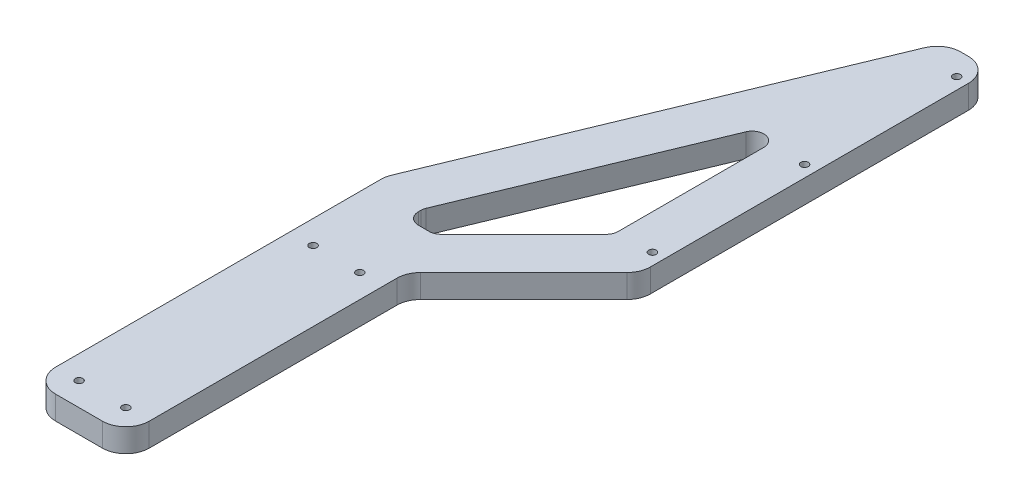
ISO-10303-21;
HEADER;
FILE_DESCRIPTION(('STEP AP214'),'2;1');
FILE_NAME('part.step','',(''),(''),'','','');
FILE_SCHEMA(('AUTOMOTIVE_DESIGN { 1 0 10303 214 1 1 1 1 }'));
ENDSEC;
DATA;
#1=APPLICATION_CONTEXT('core data for automotive mechanical design processes');
#2=APPLICATION_PROTOCOL_DEFINITION('international standard','automotive_design',2000,#1);
#3=PRODUCT_CONTEXT('',#1,'mechanical');
#4=PRODUCT('Part','Part','',(#3));
#5=PRODUCT_RELATED_PRODUCT_CATEGORY('part','',(#4));
#6=PRODUCT_DEFINITION_FORMATION('','',#4);
#7=PRODUCT_DEFINITION_CONTEXT('part definition',#1,'design');
#8=PRODUCT_DEFINITION('design','',#6,#7);
#9=PRODUCT_DEFINITION_SHAPE('','',#8);
#10=(LENGTH_UNIT() NAMED_UNIT(*) SI_UNIT(.MILLI.,.METRE.));
#11=(NAMED_UNIT(*) PLANE_ANGLE_UNIT() SI_UNIT($,.RADIAN.));
#12=(NAMED_UNIT(*) SI_UNIT($,.STERADIAN.) SOLID_ANGLE_UNIT());
#13=UNCERTAINTY_MEASURE_WITH_UNIT(LENGTH_MEASURE(1.E-05),#10,'distance_accuracy_value','');
#14=(GEOMETRIC_REPRESENTATION_CONTEXT(3) GLOBAL_UNCERTAINTY_ASSIGNED_CONTEXT((#13)) GLOBAL_UNIT_ASSIGNED_CONTEXT((#10,
#11,#12)) REPRESENTATION_CONTEXT('',''));
#15=CARTESIAN_POINT('',(0.,0.,0.));
#16=DIRECTION('',(0.,0.,1.));
#17=DIRECTION('',(1.,0.,0.));
#18=AXIS2_PLACEMENT_3D('',#15,#16,#17);
#19=CARTESIAN_POINT('',(0.,10.,0.));
#20=DIRECTION('',(0.,-1.,0.));
#21=DIRECTION('',(0.,0.,-1.));
#22=AXIS2_PLACEMENT_3D('',#19,#20,#21);
#23=PLANE('',#22);
#24=CARTESIAN_POINT('',(85.,10.,-310.000000000001));
#25=DIRECTION('',(0.,-1.,0.));
#26=DIRECTION('',(0.,0.,-1.));
#27=AXIS2_PLACEMENT_3D('',#24,#25,#26);
#28=CIRCLE('',#27,1.6);
#29=CARTESIAN_POINT('',(85.,10.,-311.600000000001));
#30=VERTEX_POINT('',#29);
#31=EDGE_CURVE('E521',#30,#30,#28,.T.);
#32=ORIENTED_EDGE('',*,*,#31,.T.);
#33=EDGE_LOOP('',(#32));
#34=FACE_BOUND('',#33,.T.);
#35=CARTESIAN_POINT('',(85.,10.,-245.000000000001));
#36=DIRECTION('',(0.,-1.,0.));
#37=DIRECTION('',(0.,0.,-1.));
#38=AXIS2_PLACEMENT_3D('',#35,#36,#37);
#39=CIRCLE('',#38,1.6);
#40=CARTESIAN_POINT('',(85.,10.,-246.600000000001));
#41=VERTEX_POINT('',#40);
#42=EDGE_CURVE('E525',#41,#41,#39,.T.);
#43=ORIENTED_EDGE('',*,*,#42,.T.);
#44=EDGE_LOOP('',(#43));
#45=FACE_BOUND('',#44,.T.);
#46=CARTESIAN_POINT('',(85.,10.,-180.000000000001));
#47=DIRECTION('',(0.,-1.,0.));
#48=DIRECTION('',(0.,0.,-1.));
#49=AXIS2_PLACEMENT_3D('',#46,#47,#48);
#50=CIRCLE('',#49,1.6);
#51=CARTESIAN_POINT('',(85.,10.,-181.600000000001));
#52=VERTEX_POINT('',#51);
#53=EDGE_CURVE('E529',#52,#52,#50,.T.);
#54=ORIENTED_EDGE('',*,*,#53,.T.);
#55=EDGE_LOOP('',(#54));
#56=FACE_BOUND('',#55,.T.);
#57=CARTESIAN_POINT('',(30.,10.,-110.));
#58=DIRECTION('',(0.,-1.,0.));
#59=DIRECTION('',(0.,0.,-1.));
#60=AXIS2_PLACEMENT_3D('',#57,#58,#59);
#61=CIRCLE('',#60,1.6);
#62=CARTESIAN_POINT('',(30.,10.,-111.6));
#63=VERTEX_POINT('',#62);
#64=EDGE_CURVE('E472',#63,#63,#61,.T.);
#65=ORIENTED_EDGE('',*,*,#64,.T.);
#66=EDGE_LOOP('',(#65));
#67=FACE_BOUND('',#66,.T.);
#68=CARTESIAN_POINT('',(10.,10.,-10.));
#69=DIRECTION('',(0.,-1.,0.));
#70=DIRECTION('',(0.,0.,-1.));
#71=AXIS2_PLACEMENT_3D('',#68,#69,#70);
#72=CIRCLE('',#71,1.6);
#73=CARTESIAN_POINT('',(10.,10.,-11.6));
#74=VERTEX_POINT('',#73);
#75=EDGE_CURVE('E493',#74,#74,#72,.T.);
#76=ORIENTED_EDGE('',*,*,#75,.T.);
#77=EDGE_LOOP('',(#76));
#78=FACE_BOUND('',#77,.T.);
#79=CARTESIAN_POINT('',(30.,10.,-10.));
#80=DIRECTION('',(0.,-1.,0.));
#81=DIRECTION('',(0.,0.,-1.));
#82=AXIS2_PLACEMENT_3D('',#79,#80,#81);
#83=CIRCLE('',#82,1.6);
#84=CARTESIAN_POINT('',(30.,10.,-11.6));
#85=VERTEX_POINT('',#84);
#86=EDGE_CURVE('E497',#85,#85,#83,.T.);
#87=ORIENTED_EDGE('',*,*,#86,.T.);
#88=EDGE_LOOP('',(#87));
#89=FACE_BOUND('',#88,.T.);
#90=CARTESIAN_POINT('',(10.,10.,-110.));
#91=DIRECTION('',(0.,-1.,0.));
#92=DIRECTION('',(0.,0.,-1.));
#93=AXIS2_PLACEMENT_3D('',#90,#91,#92);
#94=CIRCLE('',#93,1.6);
#95=CARTESIAN_POINT('',(10.,10.,-111.6));
#96=VERTEX_POINT('',#95);
#97=EDGE_CURVE('E501',#96,#96,#94,.T.);
#98=ORIENTED_EDGE('',*,*,#97,.T.);
#99=EDGE_LOOP('',(#98));
#100=FACE_BOUND('',#99,.T.);
#101=DIRECTION('',(-0.382683432365091,0.,0.923879532511286));
#102=VECTOR('',#101,1.);
#103=CARTESIAN_POINT('',(0.,10.,-151.005050633884));
#104=LINE('',#103,#102);
#105=CARTESIAN_POINT('',(67.4429910540801,10.,-313.826834323651));
#106=VERTEX_POINT('',#105);
#107=CARTESIAN_POINT('',(0.761204674887139,10.,-152.842761283739));
#108=VERTEX_POINT('',#107);
#109=EDGE_CURVE('E238',#106,#108,#104,.T.);
#110=ORIENTED_EDGE('',*,*,#109,.T.);
#111=CARTESIAN_POINT('',(10.,10.,-149.015926960088));
#112=DIRECTION('',(0.,-1.,0.));
#113=DIRECTION('',(0.,0.,-1.));
#114=AXIS2_PLACEMENT_3D('',#111,#112,#113);
#115=CIRCLE('',#114,10.);
#116=CARTESIAN_POINT('',(0.,10.,-149.015926960088));
#117=VERTEX_POINT('',#116);
#118=EDGE_CURVE('E348',#108,#117,#115,.F.);
#119=ORIENTED_EDGE('',*,*,#118,.T.);
#120=DIRECTION('',(0.,0.,1.));
#121=VECTOR('',#120,1.);
#122=CARTESIAN_POINT('',(0.,10.,0.));
#123=LINE('',#122,#121);
#124=CARTESIAN_POINT('',(0.,10.,-10.));
#125=VERTEX_POINT('',#124);
#126=EDGE_CURVE('E447',#117,#125,#123,.T.);
#127=ORIENTED_EDGE('',*,*,#126,.T.);
#128=CARTESIAN_POINT('',(10.,10.,-10.));
#129=DIRECTION('',(0.,-1.,0.));
#130=DIRECTION('',(0.,0.,-1.));
#131=AXIS2_PLACEMENT_3D('',#128,#129,#130);
#132=CIRCLE('',#131,10.);
#133=CARTESIAN_POINT('',(10.,10.,0.));
#134=VERTEX_POINT('',#133);
#135=EDGE_CURVE('E345',#125,#134,#132,.F.);
#136=ORIENTED_EDGE('',*,*,#135,.T.);
#137=DIRECTION('',(1.,0.,0.));
#138=VECTOR('',#137,1.);
#139=CARTESIAN_POINT('',(0.,10.,0.));
#140=LINE('',#139,#138);
#141=CARTESIAN_POINT('',(30.,10.,0.));
#142=VERTEX_POINT('',#141);
#143=EDGE_CURVE('E421',#134,#142,#140,.T.);
#144=ORIENTED_EDGE('',*,*,#143,.T.);
#145=CARTESIAN_POINT('',(30.,10.,-10.));
#146=DIRECTION('',(0.,-1.,0.));
#147=DIRECTION('',(0.,0.,-1.));
#148=AXIS2_PLACEMENT_3D('',#145,#146,#147);
#149=CIRCLE('',#148,10.);
#150=CARTESIAN_POINT('',(40.,10.,-10.));
#151=VERTEX_POINT('',#150);
#152=EDGE_CURVE('E342',#142,#151,#149,.F.);
#153=ORIENTED_EDGE('',*,*,#152,.T.);
#154=DIRECTION('',(0.,0.,-1.));
#155=VECTOR('',#154,1.);
#156=CARTESIAN_POINT('',(40.,10.,0.));
#157=LINE('',#156,#155);
#158=CARTESIAN_POINT('',(40.,10.,-115.857864376269));
#159=VERTEX_POINT('',#158);
#160=EDGE_CURVE('E411',#151,#159,#157,.T.);
#161=ORIENTED_EDGE('',*,*,#160,.T.);
#162=CARTESIAN_POINT('',(50.,10.,-115.857864376269));
#163=DIRECTION('',(0.,-1.,0.));
#164=DIRECTION('',(0.,0.,-1.));
#165=AXIS2_PLACEMENT_3D('',#162,#163,#164);
#166=CIRCLE('',#165,10.);
#167=CARTESIAN_POINT('',(42.9289321881345,10.,-122.928932188135));
#168=VERTEX_POINT('',#167);
#169=EDGE_CURVE('E11',#159,#168,#166,.T.);
#170=ORIENTED_EDGE('',*,*,#169,.T.);
#171=DIRECTION('',(0.707106781186543,0.,-0.707106781186551));
#172=VECTOR('',#171,1.);
#173=CARTESIAN_POINT('',(90.,10.,-170.000000000001));
#174=LINE('',#173,#172);
#175=CARTESIAN_POINT('',(87.0710678118655,10.,-167.071067811866));
#176=VERTEX_POINT('',#175);
#177=EDGE_CURVE('E409',#168,#176,#174,.T.);
#178=ORIENTED_EDGE('',*,*,#177,.T.);
#179=CARTESIAN_POINT('',(80.,10.,-174.142135623731));
#180=DIRECTION('',(0.,-1.,0.));
#181=DIRECTION('',(0.,0.,-1.));
#182=AXIS2_PLACEMENT_3D('',#179,#180,#181);
#183=CIRCLE('',#182,10.);
#184=CARTESIAN_POINT('',(90.,10.,-174.142135623731));
#185=VERTEX_POINT('',#184);
#186=EDGE_CURVE('E339',#176,#185,#183,.F.);
#187=ORIENTED_EDGE('',*,*,#186,.T.);
#188=DIRECTION('',(0.,0.,-1.));
#189=VECTOR('',#188,1.);
#190=CARTESIAN_POINT('',(90.,10.,-320.000000000001));
#191=LINE('',#190,#189);
#192=CARTESIAN_POINT('',(90.,10.,-310.000000000001));
#193=VERTEX_POINT('',#192);
#194=EDGE_CURVE('E416',#185,#193,#191,.T.);
#195=ORIENTED_EDGE('',*,*,#194,.T.);
#196=CARTESIAN_POINT('',(80.,10.,-310.000000000001));
#197=DIRECTION('',(0.,-1.,0.));
#198=DIRECTION('',(0.,0.,-1.));
#199=AXIS2_PLACEMENT_3D('',#196,#197,#198);
#200=CIRCLE('',#199,10.);
#201=CARTESIAN_POINT('',(80.,10.,-320.000000000001));
#202=VERTEX_POINT('',#201);
#203=EDGE_CURVE('E70',#193,#202,#200,.F.);
#204=ORIENTED_EDGE('',*,*,#203,.T.);
#205=DIRECTION('',(-1.,0.,0.));
#206=VECTOR('',#205,1.);
#207=CARTESIAN_POINT('',(70.,10.,-320.000000000001));
#208=LINE('',#207,#206);
#209=CARTESIAN_POINT('',(76.681786379193,10.,-320.000000000001));
#210=VERTEX_POINT('',#209);
#211=EDGE_CURVE('E245',#202,#210,#208,.T.);
#212=ORIENTED_EDGE('',*,*,#211,.T.);
#213=CARTESIAN_POINT('',(76.681786379193,10.,-310.000000000001));
#214=DIRECTION('',(0.,-1.,0.));
#215=DIRECTION('',(0.,0.,-1.));
#216=AXIS2_PLACEMENT_3D('',#213,#214,#215);
#217=CIRCLE('',#216,10.);
#218=EDGE_CURVE('E334',#210,#106,#217,.F.);
#219=ORIENTED_EDGE('',*,*,#218,.T.);
#220=EDGE_LOOP('',(#110,#119,#127,#136,#144,#153,#161,#170,#178,#187,#195,#204,#212,#219));
#221=FACE_BOUND('',#220,.T.);
#222=DIRECTION('',(0.,0.,1.));
#223=VECTOR('',#222,1.);
#224=CARTESIAN_POINT('',(20.,10.,-140.));
#225=LINE('',#224,#223);
#226=CARTESIAN_POINT('',(20.,10.,-146.032241449393));
#227=VERTEX_POINT('',#226);
#228=CARTESIAN_POINT('',(20.,10.,-145.));
#229=VERTEX_POINT('',#228);
#230=EDGE_CURVE('E233',#227,#229,#225,.T.);
#231=ORIENTED_EDGE('',*,*,#230,.F.);
#232=CARTESIAN_POINT('',(25.,10.,-146.032241449393));
#233=DIRECTION('',(0.,-1.,0.));
#234=DIRECTION('',(0.,0.,-1.));
#235=AXIS2_PLACEMENT_3D('',#232,#233,#234);
#236=CIRCLE('',#235,5.);
#237=CARTESIAN_POINT('',(20.3806023374436,10.,-147.945658611218));
#238=VERTEX_POINT('',#237);
#239=EDGE_CURVE('E280',#227,#238,#236,.T.);
#240=ORIENTED_EDGE('',*,*,#239,.T.);
#241=DIRECTION('',(-0.382683432365091,0.,0.923879532511286));
#242=VECTOR('',#241,1.);
#243=CARTESIAN_POINT('',(20.,10.,-147.026803286291));
#244=LINE('',#243,#242);
#245=CARTESIAN_POINT('',(60.3806023374435,10.,-244.514201106142));
#246=VERTEX_POINT('',#245);
#247=EDGE_CURVE('E429',#246,#238,#244,.T.);
#248=ORIENTED_EDGE('',*,*,#247,.F.);
#249=CARTESIAN_POINT('',(65.,10.,-242.600783944316));
#250=DIRECTION('',(0.,-1.,0.));
#251=DIRECTION('',(0.,0.,-1.));
#252=AXIS2_PLACEMENT_3D('',#249,#250,#251);
#253=CIRCLE('',#252,5.);
#254=CARTESIAN_POINT('',(70.,10.,-242.600783944316));
#255=VERTEX_POINT('',#254);
#256=EDGE_CURVE('E221',#246,#255,#253,.T.);
#257=ORIENTED_EDGE('',*,*,#256,.T.);
#258=DIRECTION('',(0.,0.,-1.));
#259=VECTOR('',#258,1.);
#260=CARTESIAN_POINT('',(70.,10.,-267.737481404946));
#261=LINE('',#260,#259);
#262=CARTESIAN_POINT('',(70.,10.,-180.355339059328));
#263=VERTEX_POINT('',#262);
#264=EDGE_CURVE('E475',#263,#255,#261,.T.);
#265=ORIENTED_EDGE('',*,*,#264,.F.);
#266=CARTESIAN_POINT('',(65.,10.,-180.355339059328));
#267=DIRECTION('',(0.,-1.,0.));
#268=DIRECTION('',(0.,0.,-1.));
#269=AXIS2_PLACEMENT_3D('',#266,#267,#268);
#270=CIRCLE('',#269,5.);
#271=CARTESIAN_POINT('',(68.5355339059327,10.,-176.819805153395));
#272=VERTEX_POINT('',#271);
#273=EDGE_CURVE('E299',#263,#272,#270,.T.);
#274=ORIENTED_EDGE('',*,*,#273,.T.);
#275=DIRECTION('',(0.707106781186548,0.,-0.707106781186547));
#276=VECTOR('',#275,1.);
#277=CARTESIAN_POINT('',(70.,10.,-178.284271247462));
#278=LINE('',#277,#276);
#279=CARTESIAN_POINT('',(33.1801948466048,10.,-141.464466094067));
#280=VERTEX_POINT('',#279);
#281=EDGE_CURVE('E479',#280,#272,#278,.T.);
#282=ORIENTED_EDGE('',*,*,#281,.F.);
#283=CARTESIAN_POINT('',(29.6446609406721,10.,-145.));
#284=DIRECTION('',(0.,-1.,0.));
#285=DIRECTION('',(0.,0.,-1.));
#286=AXIS2_PLACEMENT_3D('',#283,#284,#285);
#287=CIRCLE('',#286,5.);
#288=CARTESIAN_POINT('',(29.6446609406721,10.,-140.));
#289=VERTEX_POINT('',#288);
#290=EDGE_CURVE('E286',#280,#289,#287,.T.);
#291=ORIENTED_EDGE('',*,*,#290,.T.);
#292=DIRECTION('',(1.,0.,0.));
#293=VECTOR('',#292,1.);
#294=CARTESIAN_POINT('',(20.,10.,-140.));
#295=LINE('',#294,#293);
#296=CARTESIAN_POINT('',(25.,10.,-140.));
#297=VERTEX_POINT('',#296);
#298=EDGE_CURVE('E483',#297,#289,#295,.T.);
#299=ORIENTED_EDGE('',*,*,#298,.F.);
#300=CARTESIAN_POINT('',(25.,10.,-145.));
#301=DIRECTION('',(0.,-1.,0.));
#302=DIRECTION('',(0.,0.,-1.));
#303=AXIS2_PLACEMENT_3D('',#300,#301,#302);
#304=CIRCLE('',#303,5.);
#305=EDGE_CURVE('E222',#297,#229,#304,.T.);
#306=ORIENTED_EDGE('',*,*,#305,.T.);
#307=EDGE_LOOP('',(#231,#240,#248,#257,#265,#274,#282,#291,#299,#306));
#308=FACE_BOUND('',#307,.T.);
#309=ADVANCED_FACE('F47',(#34,#45,#56,#67,#78,#89,#100,#221,#308),#23,.F.);
#310=CARTESIAN_POINT('',(0.,0.,0.));
#311=DIRECTION('',(0.,-1.,0.));
#312=DIRECTION('',(0.,0.,-1.));
#313=AXIS2_PLACEMENT_3D('',#310,#311,#312);
#314=PLANE('',#313);
#315=CARTESIAN_POINT('',(85.,0.,-310.000000000001));
#316=DIRECTION('',(0.,1.,0.));
#317=DIRECTION('',(0.,0.,1.));
#318=AXIS2_PLACEMENT_3D('',#315,#316,#317);
#319=CIRCLE('',#318,1.6);
#320=CARTESIAN_POINT('',(85.,0.,-308.400000000001));
#321=VERTEX_POINT('',#320);
#322=EDGE_CURVE('E533',#321,#321,#319,.T.);
#323=ORIENTED_EDGE('',*,*,#322,.T.);
#324=EDGE_LOOP('',(#323));
#325=FACE_BOUND('',#324,.T.);
#326=CARTESIAN_POINT('',(85.,0.,-245.000000000001));
#327=DIRECTION('',(0.,1.,0.));
#328=DIRECTION('',(0.,0.,1.));
#329=AXIS2_PLACEMENT_3D('',#326,#327,#328);
#330=CIRCLE('',#329,1.6);
#331=CARTESIAN_POINT('',(85.,0.,-243.400000000001));
#332=VERTEX_POINT('',#331);
#333=EDGE_CURVE('E538',#332,#332,#330,.T.);
#334=ORIENTED_EDGE('',*,*,#333,.T.);
#335=EDGE_LOOP('',(#334));
#336=FACE_BOUND('',#335,.T.);
#337=CARTESIAN_POINT('',(85.,0.,-180.000000000001));
#338=DIRECTION('',(0.,1.,0.));
#339=DIRECTION('',(0.,0.,1.));
#340=AXIS2_PLACEMENT_3D('',#337,#338,#339);
#341=CIRCLE('',#340,1.6);
#342=CARTESIAN_POINT('',(85.,0.,-178.400000000001));
#343=VERTEX_POINT('',#342);
#344=EDGE_CURVE('E534',#343,#343,#341,.T.);
#345=ORIENTED_EDGE('',*,*,#344,.T.);
#346=EDGE_LOOP('',(#345));
#347=FACE_BOUND('',#346,.T.);
#348=CARTESIAN_POINT('',(30.,0.,-110.));
#349=DIRECTION('',(0.,1.,0.));
#350=DIRECTION('',(0.,0.,1.));
#351=AXIS2_PLACEMENT_3D('',#348,#349,#350);
#352=CIRCLE('',#351,1.6);
#353=CARTESIAN_POINT('',(30.,0.,-108.4));
#354=VERTEX_POINT('',#353);
#355=EDGE_CURVE('E509',#354,#354,#352,.T.);
#356=ORIENTED_EDGE('',*,*,#355,.T.);
#357=EDGE_LOOP('',(#356));
#358=FACE_BOUND('',#357,.T.);
#359=CARTESIAN_POINT('',(10.,0.,-10.));
#360=DIRECTION('',(0.,1.,0.));
#361=DIRECTION('',(0.,0.,1.));
#362=AXIS2_PLACEMENT_3D('',#359,#360,#361);
#363=CIRCLE('',#362,1.6);
#364=CARTESIAN_POINT('',(10.,0.,-8.4));
#365=VERTEX_POINT('',#364);
#366=EDGE_CURVE('E510',#365,#365,#363,.T.);
#367=ORIENTED_EDGE('',*,*,#366,.T.);
#368=EDGE_LOOP('',(#367));
#369=FACE_BOUND('',#368,.T.);
#370=CARTESIAN_POINT('',(30.,0.,-10.));
#371=DIRECTION('',(0.,1.,0.));
#372=DIRECTION('',(0.,0.,1.));
#373=AXIS2_PLACEMENT_3D('',#370,#371,#372);
#374=CIRCLE('',#373,1.6);
#375=CARTESIAN_POINT('',(30.,0.,-8.4));
#376=VERTEX_POINT('',#375);
#377=EDGE_CURVE('E514',#376,#376,#374,.T.);
#378=ORIENTED_EDGE('',*,*,#377,.T.);
#379=EDGE_LOOP('',(#378));
#380=FACE_BOUND('',#379,.T.);
#381=CARTESIAN_POINT('',(10.,0.,-110.));
#382=DIRECTION('',(0.,1.,0.));
#383=DIRECTION('',(0.,0.,1.));
#384=AXIS2_PLACEMENT_3D('',#381,#382,#383);
#385=CIRCLE('',#384,1.6);
#386=CARTESIAN_POINT('',(10.,0.,-108.4));
#387=VERTEX_POINT('',#386);
#388=EDGE_CURVE('E505',#387,#387,#385,.T.);
#389=ORIENTED_EDGE('',*,*,#388,.T.);
#390=EDGE_LOOP('',(#389));
#391=FACE_BOUND('',#390,.T.);
#392=DIRECTION('',(0.,0.,1.));
#393=VECTOR('',#392,1.);
#394=CARTESIAN_POINT('',(0.,0.,-120.));
#395=LINE('',#394,#393);
#396=CARTESIAN_POINT('',(0.,0.,-149.015926960088));
#397=VERTEX_POINT('',#396);
#398=CARTESIAN_POINT('',(0.,0.,-9.99999999999999));
#399=VERTEX_POINT('',#398);
#400=EDGE_CURVE('E248',#397,#399,#395,.T.);
#401=ORIENTED_EDGE('',*,*,#400,.F.);
#402=CARTESIAN_POINT('',(10.,0.,-149.015926960088));
#403=DIRECTION('',(0.,-1.,0.));
#404=DIRECTION('',(0.,0.,-1.));
#405=AXIS2_PLACEMENT_3D('',#402,#403,#404);
#406=CIRCLE('',#405,10.);
#407=CARTESIAN_POINT('',(0.761204674887139,0.,-152.842761283739));
#408=VERTEX_POINT('',#407);
#409=EDGE_CURVE('E324',#397,#408,#406,.T.);
#410=ORIENTED_EDGE('',*,*,#409,.T.);
#411=DIRECTION('',(-0.382683432365091,0.,0.923879532511286));
#412=VECTOR('',#411,1.);
#413=CARTESIAN_POINT('',(0.,0.,-151.005050633884));
#414=LINE('',#413,#412);
#415=CARTESIAN_POINT('',(67.4429910540801,0.,-313.826834323651));
#416=VERTEX_POINT('',#415);
#417=EDGE_CURVE('E439',#416,#408,#414,.T.);
#418=ORIENTED_EDGE('',*,*,#417,.F.);
#419=CARTESIAN_POINT('',(76.681786379193,0.,-310.000000000001));
#420=DIRECTION('',(0.,-1.,0.));
#421=DIRECTION('',(0.,0.,-1.));
#422=AXIS2_PLACEMENT_3D('',#419,#420,#421);
#423=CIRCLE('',#422,10.);
#424=CARTESIAN_POINT('',(76.681786379193,0.,-320.000000000001));
#425=VERTEX_POINT('',#424);
#426=EDGE_CURVE('E309',#416,#425,#423,.T.);
#427=ORIENTED_EDGE('',*,*,#426,.T.);
#428=DIRECTION('',(-1.,0.,0.));
#429=VECTOR('',#428,1.);
#430=CARTESIAN_POINT('',(70.,0.,-320.000000000001));
#431=LINE('',#430,#429);
#432=CARTESIAN_POINT('',(80.,0.,-320.000000000001));
#433=VERTEX_POINT('',#432);
#434=EDGE_CURVE('E437',#433,#425,#431,.T.);
#435=ORIENTED_EDGE('',*,*,#434,.F.);
#436=CARTESIAN_POINT('',(80.,0.,-310.000000000001));
#437=DIRECTION('',(0.,-1.,0.));
#438=DIRECTION('',(0.,0.,-1.));
#439=AXIS2_PLACEMENT_3D('',#436,#437,#438);
#440=CIRCLE('',#439,10.);
#441=CARTESIAN_POINT('',(90.,0.,-310.000000000001));
#442=VERTEX_POINT('',#441);
#443=EDGE_CURVE('E312',#433,#442,#440,.T.);
#444=ORIENTED_EDGE('',*,*,#443,.T.);
#445=DIRECTION('',(0.,0.,-1.));
#446=VECTOR('',#445,1.);
#447=CARTESIAN_POINT('',(90.,0.,-320.000000000001));
#448=LINE('',#447,#446);
#449=CARTESIAN_POINT('',(90.,0.,-174.142135623731));
#450=VERTEX_POINT('',#449);
#451=EDGE_CURVE('E433',#450,#442,#448,.T.);
#452=ORIENTED_EDGE('',*,*,#451,.F.);
#453=CARTESIAN_POINT('',(80.,0.,-174.142135623731));
#454=DIRECTION('',(0.,-1.,0.));
#455=DIRECTION('',(0.,0.,-1.));
#456=AXIS2_PLACEMENT_3D('',#453,#454,#455);
#457=CIRCLE('',#456,10.);
#458=CARTESIAN_POINT('',(87.0710678118655,0.,-167.071067811866));
#459=VERTEX_POINT('',#458);
#460=EDGE_CURVE('E315',#450,#459,#457,.T.);
#461=ORIENTED_EDGE('',*,*,#460,.T.);
#462=DIRECTION('',(0.707106781186543,0.,-0.707106781186551));
#463=VECTOR('',#462,1.);
#464=CARTESIAN_POINT('',(90.,0.,-170.000000000001));
#465=LINE('',#464,#463);
#466=CARTESIAN_POINT('',(42.9289321881345,0.,-122.928932188135));
#467=VERTEX_POINT('',#466);
#468=EDGE_CURVE('E392',#467,#459,#465,.T.);
#469=ORIENTED_EDGE('',*,*,#468,.F.);
#470=CARTESIAN_POINT('',(50.,0.,-115.857864376269));
#471=DIRECTION('',(0.,-1.,0.));
#472=DIRECTION('',(0.,0.,-1.));
#473=AXIS2_PLACEMENT_3D('',#470,#471,#472);
#474=CIRCLE('',#473,10.);
#475=CARTESIAN_POINT('',(40.,0.,-115.857864376269));
#476=VERTEX_POINT('',#475);
#477=EDGE_CURVE('E56',#467,#476,#474,.F.);
#478=ORIENTED_EDGE('',*,*,#477,.T.);
#479=DIRECTION('',(0.,0.,-1.));
#480=VECTOR('',#479,1.);
#481=CARTESIAN_POINT('',(40.,0.,0.));
#482=LINE('',#481,#480);
#483=CARTESIAN_POINT('',(40.,0.,-10.));
#484=VERTEX_POINT('',#483);
#485=EDGE_CURVE('E390',#484,#476,#482,.T.);
#486=ORIENTED_EDGE('',*,*,#485,.F.);
#487=CARTESIAN_POINT('',(30.,0.,-10.));
#488=DIRECTION('',(0.,-1.,0.));
#489=DIRECTION('',(0.,0.,-1.));
#490=AXIS2_PLACEMENT_3D('',#487,#488,#489);
#491=CIRCLE('',#490,10.);
#492=CARTESIAN_POINT('',(30.,0.,0.));
#493=VERTEX_POINT('',#492);
#494=EDGE_CURVE('E318',#484,#493,#491,.T.);
#495=ORIENTED_EDGE('',*,*,#494,.T.);
#496=DIRECTION('',(1.,0.,0.));
#497=VECTOR('',#496,1.);
#498=CARTESIAN_POINT('',(0.,0.,0.));
#499=LINE('',#498,#497);
#500=CARTESIAN_POINT('',(10.,0.,0.));
#501=VERTEX_POINT('',#500);
#502=EDGE_CURVE('E402',#501,#493,#499,.T.);
#503=ORIENTED_EDGE('',*,*,#502,.F.);
#504=CARTESIAN_POINT('',(10.,0.,-10.));
#505=DIRECTION('',(0.,-1.,0.));
#506=DIRECTION('',(0.,0.,-1.));
#507=AXIS2_PLACEMENT_3D('',#504,#505,#506);
#508=CIRCLE('',#507,10.);
#509=EDGE_CURVE('E321',#501,#399,#508,.T.);
#510=ORIENTED_EDGE('',*,*,#509,.T.);
#511=EDGE_LOOP('',(#401,#410,#418,#427,#435,#444,#452,#461,#469,#478,#486,#495,#503,#510));
#512=FACE_BOUND('',#511,.T.);
#513=DIRECTION('',(0.,0.,-1.));
#514=VECTOR('',#513,1.);
#515=CARTESIAN_POINT('',(70.,0.,-267.737481404946));
#516=LINE('',#515,#514);
#517=CARTESIAN_POINT('',(70.,0.,-180.355339059328));
#518=VERTEX_POINT('',#517);
#519=CARTESIAN_POINT('',(70.,0.,-242.600783944316));
#520=VERTEX_POINT('',#519);
#521=EDGE_CURVE('E215',#518,#520,#516,.T.);
#522=ORIENTED_EDGE('',*,*,#521,.T.);
#523=CARTESIAN_POINT('',(65.,0.,-242.600783944316));
#524=DIRECTION('',(0.,-1.,0.));
#525=DIRECTION('',(0.,0.,-1.));
#526=AXIS2_PLACEMENT_3D('',#523,#524,#525);
#527=CIRCLE('',#526,5.);
#528=CARTESIAN_POINT('',(60.3806023374435,0.,-244.514201106142));
#529=VERTEX_POINT('',#528);
#530=EDGE_CURVE('E210',#520,#529,#527,.F.);
#531=ORIENTED_EDGE('',*,*,#530,.T.);
#532=DIRECTION('',(-0.382683432365091,0.,0.923879532511286));
#533=VECTOR('',#532,1.);
#534=CARTESIAN_POINT('',(20.,0.,-147.026803286291));
#535=LINE('',#534,#533);
#536=CARTESIAN_POINT('',(20.3806023374436,0.,-147.945658611218));
#537=VERTEX_POINT('',#536);
#538=EDGE_CURVE('E213',#529,#537,#535,.T.);
#539=ORIENTED_EDGE('',*,*,#538,.T.);
#540=CARTESIAN_POINT('',(25.,0.,-146.032241449393));
#541=DIRECTION('',(0.,-1.,0.));
#542=DIRECTION('',(0.,0.,-1.));
#543=AXIS2_PLACEMENT_3D('',#540,#541,#542);
#544=CIRCLE('',#543,5.);
#545=CARTESIAN_POINT('',(20.,0.,-146.032241449393));
#546=VERTEX_POINT('',#545);
#547=EDGE_CURVE('E277',#537,#546,#544,.F.);
#548=ORIENTED_EDGE('',*,*,#547,.T.);
#549=DIRECTION('',(0.,0.,1.));
#550=VECTOR('',#549,1.);
#551=CARTESIAN_POINT('',(20.,0.,-140.));
#552=LINE('',#551,#550);
#553=CARTESIAN_POINT('',(20.,0.,-145.));
#554=VERTEX_POINT('',#553);
#555=EDGE_CURVE('E468',#546,#554,#552,.T.);
#556=ORIENTED_EDGE('',*,*,#555,.T.);
#557=CARTESIAN_POINT('',(25.,0.,-145.));
#558=DIRECTION('',(0.,-1.,0.));
#559=DIRECTION('',(0.,0.,-1.));
#560=AXIS2_PLACEMENT_3D('',#557,#558,#559);
#561=CIRCLE('',#560,5.);
#562=CARTESIAN_POINT('',(25.,0.,-140.));
#563=VERTEX_POINT('',#562);
#564=EDGE_CURVE('E289',#554,#563,#561,.F.);
#565=ORIENTED_EDGE('',*,*,#564,.T.);
#566=DIRECTION('',(1.,0.,0.));
#567=VECTOR('',#566,1.);
#568=CARTESIAN_POINT('',(20.,0.,-140.));
#569=LINE('',#568,#567);
#570=CARTESIAN_POINT('',(29.6446609406721,0.,-140.));
#571=VERTEX_POINT('',#570);
#572=EDGE_CURVE('E464',#563,#571,#569,.T.);
#573=ORIENTED_EDGE('',*,*,#572,.T.);
#574=CARTESIAN_POINT('',(29.6446609406721,0.,-145.));
#575=DIRECTION('',(0.,-1.,0.));
#576=DIRECTION('',(0.,0.,-1.));
#577=AXIS2_PLACEMENT_3D('',#574,#575,#576);
#578=CIRCLE('',#577,5.);
#579=CARTESIAN_POINT('',(33.1801948466048,0.,-141.464466094067));
#580=VERTEX_POINT('',#579);
#581=EDGE_CURVE('E283',#571,#580,#578,.F.);
#582=ORIENTED_EDGE('',*,*,#581,.T.);
#583=DIRECTION('',(0.707106781186548,0.,-0.707106781186547));
#584=VECTOR('',#583,1.);
#585=CARTESIAN_POINT('',(70.,0.,-178.284271247462));
#586=LINE('',#585,#584);
#587=CARTESIAN_POINT('',(68.5355339059327,0.,-176.819805153395));
#588=VERTEX_POINT('',#587);
#589=EDGE_CURVE('E460',#580,#588,#586,.T.);
#590=ORIENTED_EDGE('',*,*,#589,.T.);
#591=CARTESIAN_POINT('',(65.,0.,-180.355339059328));
#592=DIRECTION('',(0.,-1.,0.));
#593=DIRECTION('',(0.,0.,-1.));
#594=AXIS2_PLACEMENT_3D('',#591,#592,#593);
#595=CIRCLE('',#594,5.);
#596=EDGE_CURVE('E296',#588,#518,#595,.F.);
#597=ORIENTED_EDGE('',*,*,#596,.T.);
#598=EDGE_LOOP('',(#522,#531,#539,#548,#556,#565,#573,#582,#590,#597));
#599=FACE_BOUND('',#598,.T.);
#600=ADVANCED_FACE('F212',(#325,#336,#347,#358,#369,#380,#391,#512,#599),#314,.T.);
#601=CARTESIAN_POINT('',(0.,10.,0.));
#602=DIRECTION('',(0.,0.,-1.));
#603=DIRECTION('',(-1.,0.,0.));
#604=AXIS2_PLACEMENT_3D('',#601,#602,#603);
#605=PLANE('',#604);
#606=ORIENTED_EDGE('',*,*,#143,.F.);
#607=DIRECTION('',(0.,-1.,0.));
#608=VECTOR('',#607,1.);
#609=CARTESIAN_POINT('',(10.,10.,0.));
#610=LINE('',#609,#608);
#611=EDGE_CURVE('E354',#134,#501,#610,.T.);
#612=ORIENTED_EDGE('',*,*,#611,.T.);
#613=ORIENTED_EDGE('',*,*,#502,.T.);
#614=DIRECTION('',(0.,-1.,0.));
#615=VECTOR('',#614,1.);
#616=CARTESIAN_POINT('',(30.,10.,0.));
#617=LINE('',#616,#615);
#618=EDGE_CURVE('E351',#493,#142,#617,.F.);
#619=ORIENTED_EDGE('',*,*,#618,.T.);
#620=EDGE_LOOP('',(#606,#612,#613,#619));
#621=FACE_BOUND('',#620,.T.);
#622=ADVANCED_FACE('F607',(#621),#605,.F.);
#623=CARTESIAN_POINT('',(40.,10.,0.));
#624=DIRECTION('',(-1.,0.,0.));
#625=DIRECTION('',(0.,0.,1.));
#626=AXIS2_PLACEMENT_3D('',#623,#624,#625);
#627=PLANE('',#626);
#628=ORIENTED_EDGE('',*,*,#160,.F.);
#629=DIRECTION('',(0.,-1.,0.));
#630=VECTOR('',#629,1.);
#631=CARTESIAN_POINT('',(40.,10.,-10.));
#632=LINE('',#631,#630);
#633=EDGE_CURVE('E361',#151,#484,#632,.T.);
#634=ORIENTED_EDGE('',*,*,#633,.T.);
#635=ORIENTED_EDGE('',*,*,#485,.T.);
#636=DIRECTION('',(0.,-1.,0.));
#637=VECTOR('',#636,1.);
#638=CARTESIAN_POINT('',(40.,10.,-115.857864376269));
#639=LINE('',#638,#637);
#640=EDGE_CURVE('E358',#476,#159,#639,.F.);
#641=ORIENTED_EDGE('',*,*,#640,.T.);
#642=EDGE_LOOP('',(#628,#634,#635,#641));
#643=FACE_BOUND('',#642,.T.);
#644=ADVANCED_FACE('F398',(#643),#627,.F.);
#645=CARTESIAN_POINT('',(90.,10.,-170.000000000001));
#646=DIRECTION('',(-0.707106781186552,0.,-0.707106781186544));
#647=DIRECTION('',(-0.707106781186544,0.,0.707106781186552));
#648=AXIS2_PLACEMENT_3D('',#645,#646,#647);
#649=PLANE('',#648);
#650=ORIENTED_EDGE('',*,*,#177,.F.);
#651=DIRECTION('',(0.,-1.,0.));
#652=VECTOR('',#651,1.);
#653=CARTESIAN_POINT('',(42.9289321881345,0.,-122.928932188135));
#654=LINE('',#653,#652);
#655=EDGE_CURVE('E368',#168,#467,#654,.T.);
#656=ORIENTED_EDGE('',*,*,#655,.T.);
#657=ORIENTED_EDGE('',*,*,#468,.T.);
#658=DIRECTION('',(0.,-1.,0.));
#659=VECTOR('',#658,1.);
#660=CARTESIAN_POINT('',(87.0710678118655,10.,-167.071067811866));
#661=LINE('',#660,#659);
#662=EDGE_CURVE('E365',#459,#176,#661,.F.);
#663=ORIENTED_EDGE('',*,*,#662,.T.);
#664=EDGE_LOOP('',(#650,#656,#657,#663));
#665=FACE_BOUND('',#664,.T.);
#666=ADVANCED_FACE('F413',(#665),#649,.F.);
#667=CARTESIAN_POINT('',(90.,10.,-320.000000000001));
#668=DIRECTION('',(-1.,0.,0.));
#669=DIRECTION('',(0.,0.,1.));
#670=AXIS2_PLACEMENT_3D('',#667,#668,#669);
#671=PLANE('',#670);
#672=ORIENTED_EDGE('',*,*,#194,.F.);
#673=DIRECTION('',(0.,-1.,0.));
#674=VECTOR('',#673,1.);
#675=CARTESIAN_POINT('',(90.,10.,-174.142135623731));
#676=LINE('',#675,#674);
#677=EDGE_CURVE('E375',#185,#450,#676,.T.);
#678=ORIENTED_EDGE('',*,*,#677,.T.);
#679=ORIENTED_EDGE('',*,*,#451,.T.);
#680=DIRECTION('',(0.,-1.,0.));
#681=VECTOR('',#680,1.);
#682=CARTESIAN_POINT('',(90.,10.,-310.000000000001));
#683=LINE('',#682,#681);
#684=EDGE_CURVE('E372',#442,#193,#683,.F.);
#685=ORIENTED_EDGE('',*,*,#684,.T.);
#686=EDGE_LOOP('',(#672,#678,#679,#685));
#687=FACE_BOUND('',#686,.T.);
#688=ADVANCED_FACE('F616',(#687),#671,.F.);
#689=CARTESIAN_POINT('',(70.,10.,-320.000000000001));
#690=DIRECTION('',(0.,0.,1.));
#691=DIRECTION('',(1.,0.,0.));
#692=AXIS2_PLACEMENT_3D('',#689,#690,#691);
#693=PLANE('',#692);
#694=ORIENTED_EDGE('',*,*,#211,.F.);
#695=DIRECTION('',(0.,-1.,0.));
#696=VECTOR('',#695,1.);
#697=CARTESIAN_POINT('',(80.,10.,-320.000000000001));
#698=LINE('',#697,#696);
#699=EDGE_CURVE('E381',#202,#433,#698,.T.);
#700=ORIENTED_EDGE('',*,*,#699,.T.);
#701=ORIENTED_EDGE('',*,*,#434,.T.);
#702=DIRECTION('',(0.,-1.,0.));
#703=VECTOR('',#702,1.);
#704=CARTESIAN_POINT('',(76.681786379193,10.,-320.000000000001));
#705=LINE('',#704,#703);
#706=EDGE_CURVE('E63',#425,#210,#705,.F.);
#707=ORIENTED_EDGE('',*,*,#706,.T.);
#708=EDGE_LOOP('',(#694,#700,#701,#707));
#709=FACE_BOUND('',#708,.T.);
#710=ADVANCED_FACE('F613',(#709),#693,.F.);
#711=CARTESIAN_POINT('',(0.,10.,-151.005050633884));
#712=DIRECTION('',(0.923879532511286,0.,0.382683432365091));
#713=DIRECTION('',(0.382683432365091,0.,-0.923879532511287));
#714=AXIS2_PLACEMENT_3D('',#711,#712,#713);
#715=PLANE('',#714);
#716=ORIENTED_EDGE('',*,*,#417,.T.);
#717=DIRECTION('',(0.,-1.,0.));
#718=VECTOR('',#717,1.);
#719=CARTESIAN_POINT('',(0.761204674887139,10.,-152.842761283739));
#720=LINE('',#719,#718);
#721=EDGE_CURVE('E331',#408,#108,#720,.F.);
#722=ORIENTED_EDGE('',*,*,#721,.T.);
#723=ORIENTED_EDGE('',*,*,#109,.F.);
#724=DIRECTION('',(0.,-1.,0.));
#725=VECTOR('',#724,1.);
#726=CARTESIAN_POINT('',(67.4429910540801,10.,-313.826834323651));
#727=LINE('',#726,#725);
#728=EDGE_CURVE('E327',#106,#416,#727,.T.);
#729=ORIENTED_EDGE('',*,*,#728,.T.);
#730=EDGE_LOOP('',(#716,#722,#723,#729));
#731=FACE_BOUND('',#730,.T.);
#732=ADVANCED_FACE('F610',(#731),#715,.F.);
#733=CARTESIAN_POINT('',(0.,10.,-120.));
#734=DIRECTION('',(1.,0.,0.));
#735=DIRECTION('',(0.,0.,-1.));
#736=AXIS2_PLACEMENT_3D('',#733,#734,#735);
#737=PLANE('',#736);
#738=ORIENTED_EDGE('',*,*,#126,.F.);
#739=DIRECTION('',(0.,-1.,0.));
#740=VECTOR('',#739,1.);
#741=CARTESIAN_POINT('',(0.,10.,-149.015926960088));
#742=LINE('',#741,#740);
#743=EDGE_CURVE('E305',#117,#397,#742,.T.);
#744=ORIENTED_EDGE('',*,*,#743,.T.);
#745=ORIENTED_EDGE('',*,*,#400,.T.);
#746=DIRECTION('',(0.,-1.,0.));
#747=VECTOR('',#746,1.);
#748=CARTESIAN_POINT('',(0.,10.,-9.99999999999999));
#749=LINE('',#748,#747);
#750=EDGE_CURVE('E302',#399,#125,#749,.F.);
#751=ORIENTED_EDGE('',*,*,#750,.T.);
#752=EDGE_LOOP('',(#738,#744,#745,#751));
#753=FACE_BOUND('',#752,.T.);
#754=ADVANCED_FACE('F602',(#753),#737,.F.);
#755=CARTESIAN_POINT('',(20.,10.,-140.));
#756=DIRECTION('',(1.,0.,0.));
#757=DIRECTION('',(0.,0.,-1.));
#758=AXIS2_PLACEMENT_3D('',#755,#756,#757);
#759=PLANE('',#758);
#760=ORIENTED_EDGE('',*,*,#555,.F.);
#761=DIRECTION('',(0.,-1.,0.));
#762=VECTOR('',#761,1.);
#763=CARTESIAN_POINT('',(20.,10.,-146.032241449393));
#764=LINE('',#763,#762);
#765=EDGE_CURVE('E254',#546,#227,#764,.F.);
#766=ORIENTED_EDGE('',*,*,#765,.T.);
#767=ORIENTED_EDGE('',*,*,#230,.T.);
#768=DIRECTION('',(0.,-1.,0.));
#769=VECTOR('',#768,1.);
#770=CARTESIAN_POINT('',(20.,0.,-145.));
#771=LINE('',#770,#769);
#772=EDGE_CURVE('E242',#229,#554,#771,.T.);
#773=ORIENTED_EDGE('',*,*,#772,.T.);
#774=EDGE_LOOP('',(#760,#766,#767,#773));
#775=FACE_BOUND('',#774,.T.);
#776=ADVANCED_FACE('F599',(#775),#759,.T.);
#777=CARTESIAN_POINT('',(20.,10.,-140.));
#778=DIRECTION('',(0.,0.,-1.));
#779=DIRECTION('',(-1.,0.,0.));
#780=AXIS2_PLACEMENT_3D('',#777,#778,#779);
#781=PLANE('',#780);
#782=ORIENTED_EDGE('',*,*,#298,.T.);
#783=DIRECTION('',(0.,-1.,0.));
#784=VECTOR('',#783,1.);
#785=CARTESIAN_POINT('',(29.6446609406721,0.,-140.));
#786=LINE('',#785,#784);
#787=EDGE_CURVE('E260',#289,#571,#786,.T.);
#788=ORIENTED_EDGE('',*,*,#787,.T.);
#789=ORIENTED_EDGE('',*,*,#572,.F.);
#790=DIRECTION('',(0.,-1.,0.));
#791=VECTOR('',#790,1.);
#792=CARTESIAN_POINT('',(25.,10.,-140.));
#793=LINE('',#792,#791);
#794=EDGE_CURVE('E257',#563,#297,#793,.F.);
#795=ORIENTED_EDGE('',*,*,#794,.T.);
#796=EDGE_LOOP('',(#782,#788,#789,#795));
#797=FACE_BOUND('',#796,.T.);
#798=ADVANCED_FACE('F595',(#797),#781,.T.);
#799=CARTESIAN_POINT('',(70.,10.,-178.284271247462));
#800=DIRECTION('',(-0.707106781186547,0.,-0.707106781186548));
#801=DIRECTION('',(-0.707106781186548,0.,0.707106781186547));
#802=AXIS2_PLACEMENT_3D('',#799,#800,#801);
#803=PLANE('',#802);
#804=ORIENTED_EDGE('',*,*,#589,.F.);
#805=DIRECTION('',(0.,-1.,0.));
#806=VECTOR('',#805,1.);
#807=CARTESIAN_POINT('',(33.1801948466048,10.,-141.464466094067));
#808=LINE('',#807,#806);
#809=EDGE_CURVE('E268',#580,#280,#808,.F.);
#810=ORIENTED_EDGE('',*,*,#809,.T.);
#811=ORIENTED_EDGE('',*,*,#281,.T.);
#812=DIRECTION('',(0.,-1.,0.));
#813=VECTOR('',#812,1.);
#814=CARTESIAN_POINT('',(68.5355339059327,0.,-176.819805153395));
#815=LINE('',#814,#813);
#816=EDGE_CURVE('E264',#272,#588,#815,.T.);
#817=ORIENTED_EDGE('',*,*,#816,.T.);
#818=EDGE_LOOP('',(#804,#810,#811,#817));
#819=FACE_BOUND('',#818,.T.);
#820=ADVANCED_FACE('F591',(#819),#803,.T.);
#821=CARTESIAN_POINT('',(70.,10.,-267.737481404946));
#822=DIRECTION('',(-1.,0.,0.));
#823=DIRECTION('',(0.,0.,1.));
#824=AXIS2_PLACEMENT_3D('',#821,#822,#823);
#825=PLANE('',#824);
#826=ORIENTED_EDGE('',*,*,#264,.T.);
#827=DIRECTION('',(0.,-1.,0.));
#828=VECTOR('',#827,1.);
#829=CARTESIAN_POINT('',(70.,0.,-242.600783944316));
#830=LINE('',#829,#828);
#831=EDGE_CURVE('E274',#255,#520,#830,.T.);
#832=ORIENTED_EDGE('',*,*,#831,.T.);
#833=ORIENTED_EDGE('',*,*,#521,.F.);
#834=DIRECTION('',(0.,-1.,0.));
#835=VECTOR('',#834,1.);
#836=CARTESIAN_POINT('',(70.,10.,-180.355339059328));
#837=LINE('',#836,#835);
#838=EDGE_CURVE('E271',#518,#263,#837,.F.);
#839=ORIENTED_EDGE('',*,*,#838,.T.);
#840=EDGE_LOOP('',(#826,#832,#833,#839));
#841=FACE_BOUND('',#840,.T.);
#842=ADVANCED_FACE('F583',(#841),#825,.T.);
#843=CARTESIAN_POINT('',(20.,10.,-147.026803286291));
#844=DIRECTION('',(0.923879532511287,0.,0.382683432365091));
#845=DIRECTION('',(0.382683432365091,0.,-0.923879532511287));
#846=AXIS2_PLACEMENT_3D('',#843,#844,#845);
#847=PLANE('',#846);
#848=ORIENTED_EDGE('',*,*,#247,.T.);
#849=DIRECTION('',(0.,-1.,0.));
#850=VECTOR('',#849,1.);
#851=CARTESIAN_POINT('',(20.3806023374436,0.,-147.945658611218));
#852=LINE('',#851,#850);
#853=EDGE_CURVE('E231',#238,#537,#852,.T.);
#854=ORIENTED_EDGE('',*,*,#853,.T.);
#855=ORIENTED_EDGE('',*,*,#538,.F.);
#856=DIRECTION('',(0.,-1.,0.));
#857=VECTOR('',#856,1.);
#858=CARTESIAN_POINT('',(60.3806023374436,10.,-244.514201106142));
#859=LINE('',#858,#857);
#860=EDGE_CURVE('E228',#529,#246,#859,.F.);
#861=ORIENTED_EDGE('',*,*,#860,.T.);
#862=EDGE_LOOP('',(#848,#854,#855,#861));
#863=FACE_BOUND('',#862,.T.);
#864=ADVANCED_FACE('F227',(#863),#847,.T.);
#865=CARTESIAN_POINT('',(10.,0.,-110.));
#866=DIRECTION('',(0.,1.,0.));
#867=DIRECTION('',(0.,0.,1.));
#868=AXIS2_PLACEMENT_3D('',#865,#866,#867);
#869=CYLINDRICAL_SURFACE('',#868,1.6);
#870=ORIENTED_EDGE('',*,*,#388,.F.);
#871=EDGE_LOOP('',(#870));
#872=FACE_BOUND('',#871,.T.);
#873=ORIENTED_EDGE('',*,*,#97,.F.);
#874=EDGE_LOOP('',(#873));
#875=FACE_BOUND('',#874,.T.);
#876=ADVANCED_FACE('F571',(#872,#875),#869,.F.);
#877=CARTESIAN_POINT('',(30.,0.,-10.));
#878=DIRECTION('',(0.,1.,0.));
#879=DIRECTION('',(0.,0.,1.));
#880=AXIS2_PLACEMENT_3D('',#877,#878,#879);
#881=CYLINDRICAL_SURFACE('',#880,1.6);
#882=ORIENTED_EDGE('',*,*,#377,.F.);
#883=EDGE_LOOP('',(#882));
#884=FACE_BOUND('',#883,.T.);
#885=ORIENTED_EDGE('',*,*,#86,.F.);
#886=EDGE_LOOP('',(#885));
#887=FACE_BOUND('',#886,.T.);
#888=ADVANCED_FACE('F573',(#884,#887),#881,.F.);
#889=CARTESIAN_POINT('',(10.,0.,-10.));
#890=DIRECTION('',(0.,1.,0.));
#891=DIRECTION('',(0.,0.,1.));
#892=AXIS2_PLACEMENT_3D('',#889,#890,#891);
#893=CYLINDRICAL_SURFACE('',#892,1.6);
#894=ORIENTED_EDGE('',*,*,#366,.F.);
#895=EDGE_LOOP('',(#894));
#896=FACE_BOUND('',#895,.T.);
#897=ORIENTED_EDGE('',*,*,#75,.F.);
#898=EDGE_LOOP('',(#897));
#899=FACE_BOUND('',#898,.T.);
#900=ADVANCED_FACE('F579',(#896,#899),#893,.F.);
#901=CARTESIAN_POINT('',(30.,0.,-110.));
#902=DIRECTION('',(0.,1.,0.));
#903=DIRECTION('',(0.,0.,1.));
#904=AXIS2_PLACEMENT_3D('',#901,#902,#903);
#905=CYLINDRICAL_SURFACE('',#904,1.6);
#906=ORIENTED_EDGE('',*,*,#355,.F.);
#907=EDGE_LOOP('',(#906));
#908=FACE_BOUND('',#907,.T.);
#909=ORIENTED_EDGE('',*,*,#64,.F.);
#910=EDGE_LOOP('',(#909));
#911=FACE_BOUND('',#910,.T.);
#912=ADVANCED_FACE('F631',(#908,#911),#905,.F.);
#913=CARTESIAN_POINT('',(25.,10.,-146.032241449393));
#914=DIRECTION('',(0.,1.,0.));
#915=DIRECTION('',(0.,0.,1.));
#916=AXIS2_PLACEMENT_3D('',#913,#914,#915);
#917=CYLINDRICAL_SURFACE('',#916,5.);
#918=ORIENTED_EDGE('',*,*,#239,.F.);
#919=ORIENTED_EDGE('',*,*,#765,.F.);
#920=ORIENTED_EDGE('',*,*,#547,.F.);
#921=ORIENTED_EDGE('',*,*,#853,.F.);
#922=EDGE_LOOP('',(#918,#919,#920,#921));
#923=FACE_BOUND('',#922,.T.);
#924=ADVANCED_FACE('F627',(#923),#917,.F.);
#925=CARTESIAN_POINT('',(29.6446609406721,10.,-145.));
#926=DIRECTION('',(0.,1.,0.));
#927=DIRECTION('',(0.,0.,1.));
#928=AXIS2_PLACEMENT_3D('',#925,#926,#927);
#929=CYLINDRICAL_SURFACE('',#928,5.);
#930=ORIENTED_EDGE('',*,*,#290,.F.);
#931=ORIENTED_EDGE('',*,*,#809,.F.);
#932=ORIENTED_EDGE('',*,*,#581,.F.);
#933=ORIENTED_EDGE('',*,*,#787,.F.);
#934=EDGE_LOOP('',(#930,#931,#932,#933));
#935=FACE_BOUND('',#934,.T.);
#936=ADVANCED_FACE('F630',(#935),#929,.F.);
#937=CARTESIAN_POINT('',(25.,10.,-145.));
#938=DIRECTION('',(0.,1.,0.));
#939=DIRECTION('',(0.,0.,1.));
#940=AXIS2_PLACEMENT_3D('',#937,#938,#939);
#941=CYLINDRICAL_SURFACE('',#940,5.);
#942=ORIENTED_EDGE('',*,*,#305,.F.);
#943=ORIENTED_EDGE('',*,*,#794,.F.);
#944=ORIENTED_EDGE('',*,*,#564,.F.);
#945=ORIENTED_EDGE('',*,*,#772,.F.);
#946=EDGE_LOOP('',(#942,#943,#944,#945));
#947=FACE_BOUND('',#946,.T.);
#948=ADVANCED_FACE('F635',(#947),#941,.F.);
#949=CARTESIAN_POINT('',(65.,10.,-242.600783944316));
#950=DIRECTION('',(0.,1.,0.));
#951=DIRECTION('',(0.,0.,1.));
#952=AXIS2_PLACEMENT_3D('',#949,#950,#951);
#953=CYLINDRICAL_SURFACE('',#952,5.);
#954=ORIENTED_EDGE('',*,*,#256,.F.);
#955=ORIENTED_EDGE('',*,*,#860,.F.);
#956=ORIENTED_EDGE('',*,*,#530,.F.);
#957=ORIENTED_EDGE('',*,*,#831,.F.);
#958=EDGE_LOOP('',(#954,#955,#956,#957));
#959=FACE_BOUND('',#958,.T.);
#960=ADVANCED_FACE('F236',(#959),#953,.F.);
#961=CARTESIAN_POINT('',(65.,10.,-180.355339059328));
#962=DIRECTION('',(0.,1.,0.));
#963=DIRECTION('',(0.,0.,1.));
#964=AXIS2_PLACEMENT_3D('',#961,#962,#963);
#965=CYLINDRICAL_SURFACE('',#964,5.);
#966=ORIENTED_EDGE('',*,*,#273,.F.);
#967=ORIENTED_EDGE('',*,*,#838,.F.);
#968=ORIENTED_EDGE('',*,*,#596,.F.);
#969=ORIENTED_EDGE('',*,*,#816,.F.);
#970=EDGE_LOOP('',(#966,#967,#968,#969));
#971=FACE_BOUND('',#970,.T.);
#972=ADVANCED_FACE('F642',(#971),#965,.F.);
#973=CARTESIAN_POINT('',(85.,0.,-180.000000000001));
#974=DIRECTION('',(0.,1.,0.));
#975=DIRECTION('',(0.,0.,1.));
#976=AXIS2_PLACEMENT_3D('',#973,#974,#975);
#977=CYLINDRICAL_SURFACE('',#976,1.6);
#978=ORIENTED_EDGE('',*,*,#344,.F.);
#979=EDGE_LOOP('',(#978));
#980=FACE_BOUND('',#979,.T.);
#981=ORIENTED_EDGE('',*,*,#53,.F.);
#982=EDGE_LOOP('',(#981));
#983=FACE_BOUND('',#982,.T.);
#984=ADVANCED_FACE('F645',(#980,#983),#977,.F.);
#985=CARTESIAN_POINT('',(85.,0.,-245.000000000001));
#986=DIRECTION('',(0.,1.,0.));
#987=DIRECTION('',(0.,0.,1.));
#988=AXIS2_PLACEMENT_3D('',#985,#986,#987);
#989=CYLINDRICAL_SURFACE('',#988,1.6);
#990=ORIENTED_EDGE('',*,*,#333,.F.);
#991=EDGE_LOOP('',(#990));
#992=FACE_BOUND('',#991,.T.);
#993=ORIENTED_EDGE('',*,*,#42,.F.);
#994=EDGE_LOOP('',(#993));
#995=FACE_BOUND('',#994,.T.);
#996=ADVANCED_FACE('F552',(#992,#995),#989,.F.);
#997=CARTESIAN_POINT('',(85.,0.,-310.000000000001));
#998=DIRECTION('',(0.,1.,0.));
#999=DIRECTION('',(0.,0.,1.));
#1000=AXIS2_PLACEMENT_3D('',#997,#998,#999);
#1001=CYLINDRICAL_SURFACE('',#1000,1.6);
#1002=ORIENTED_EDGE('',*,*,#322,.F.);
#1003=EDGE_LOOP('',(#1002));
#1004=FACE_BOUND('',#1003,.T.);
#1005=ORIENTED_EDGE('',*,*,#31,.F.);
#1006=EDGE_LOOP('',(#1005));
#1007=FACE_BOUND('',#1006,.T.);
#1008=ADVANCED_FACE('F548',(#1004,#1007),#1001,.F.);
#1009=CARTESIAN_POINT('',(10.,10.,-149.015926960088));
#1010=DIRECTION('',(0.,-1.,0.));
#1011=DIRECTION('',(0.,0.,-1.));
#1012=AXIS2_PLACEMENT_3D('',#1009,#1010,#1011);
#1013=CYLINDRICAL_SURFACE('',#1012,10.);
#1014=ORIENTED_EDGE('',*,*,#118,.F.);
#1015=ORIENTED_EDGE('',*,*,#721,.F.);
#1016=ORIENTED_EDGE('',*,*,#409,.F.);
#1017=ORIENTED_EDGE('',*,*,#743,.F.);
#1018=EDGE_LOOP('',(#1014,#1015,#1016,#1017));
#1019=FACE_BOUND('',#1018,.T.);
#1020=ADVANCED_FACE('F551',(#1019),#1013,.T.);
#1021=CARTESIAN_POINT('',(10.,10.,-10.));
#1022=DIRECTION('',(0.,-1.,0.));
#1023=DIRECTION('',(0.,0.,-1.));
#1024=AXIS2_PLACEMENT_3D('',#1021,#1022,#1023);
#1025=CYLINDRICAL_SURFACE('',#1024,10.);
#1026=ORIENTED_EDGE('',*,*,#135,.F.);
#1027=ORIENTED_EDGE('',*,*,#750,.F.);
#1028=ORIENTED_EDGE('',*,*,#509,.F.);
#1029=ORIENTED_EDGE('',*,*,#611,.F.);
#1030=EDGE_LOOP('',(#1026,#1027,#1028,#1029));
#1031=FACE_BOUND('',#1030,.T.);
#1032=ADVANCED_FACE('F649',(#1031),#1025,.T.);
#1033=CARTESIAN_POINT('',(30.,10.,-10.));
#1034=DIRECTION('',(0.,-1.,0.));
#1035=DIRECTION('',(0.,0.,-1.));
#1036=AXIS2_PLACEMENT_3D('',#1033,#1034,#1035);
#1037=CYLINDRICAL_SURFACE('',#1036,10.);
#1038=ORIENTED_EDGE('',*,*,#152,.F.);
#1039=ORIENTED_EDGE('',*,*,#618,.F.);
#1040=ORIENTED_EDGE('',*,*,#494,.F.);
#1041=ORIENTED_EDGE('',*,*,#633,.F.);
#1042=EDGE_LOOP('',(#1038,#1039,#1040,#1041));
#1043=FACE_BOUND('',#1042,.T.);
#1044=ADVANCED_FACE('F653',(#1043),#1037,.T.);
#1045=CARTESIAN_POINT('',(50.,10.,-115.857864376269));
#1046=DIRECTION('',(0.,1.,0.));
#1047=DIRECTION('',(0.,0.,1.));
#1048=AXIS2_PLACEMENT_3D('',#1045,#1046,#1047);
#1049=CYLINDRICAL_SURFACE('',#1048,10.);
#1050=ORIENTED_EDGE('',*,*,#169,.F.);
#1051=ORIENTED_EDGE('',*,*,#640,.F.);
#1052=ORIENTED_EDGE('',*,*,#477,.F.);
#1053=ORIENTED_EDGE('',*,*,#655,.F.);
#1054=EDGE_LOOP('',(#1050,#1051,#1052,#1053));
#1055=FACE_BOUND('',#1054,.T.);
#1056=ADVANCED_FACE('F405',(#1055),#1049,.F.);
#1057=CARTESIAN_POINT('',(80.,10.,-174.142135623731));
#1058=DIRECTION('',(0.,-1.,0.));
#1059=DIRECTION('',(0.,0.,-1.));
#1060=AXIS2_PLACEMENT_3D('',#1057,#1058,#1059);
#1061=CYLINDRICAL_SURFACE('',#1060,10.);
#1062=ORIENTED_EDGE('',*,*,#186,.F.);
#1063=ORIENTED_EDGE('',*,*,#662,.F.);
#1064=ORIENTED_EDGE('',*,*,#460,.F.);
#1065=ORIENTED_EDGE('',*,*,#677,.F.);
#1066=EDGE_LOOP('',(#1062,#1063,#1064,#1065));
#1067=FACE_BOUND('',#1066,.T.);
#1068=ADVANCED_FACE('F660',(#1067),#1061,.T.);
#1069=CARTESIAN_POINT('',(80.,10.,-310.000000000001));
#1070=DIRECTION('',(0.,-1.,0.));
#1071=DIRECTION('',(0.,0.,-1.));
#1072=AXIS2_PLACEMENT_3D('',#1069,#1070,#1071);
#1073=CYLINDRICAL_SURFACE('',#1072,10.);
#1074=ORIENTED_EDGE('',*,*,#203,.F.);
#1075=ORIENTED_EDGE('',*,*,#684,.F.);
#1076=ORIENTED_EDGE('',*,*,#443,.F.);
#1077=ORIENTED_EDGE('',*,*,#699,.F.);
#1078=EDGE_LOOP('',(#1074,#1075,#1076,#1077));
#1079=FACE_BOUND('',#1078,.T.);
#1080=ADVANCED_FACE('F662',(#1079),#1073,.T.);
#1081=CARTESIAN_POINT('',(76.681786379193,10.,-310.000000000001));
#1082=DIRECTION('',(0.,-1.,0.));
#1083=DIRECTION('',(0.,0.,-1.));
#1084=AXIS2_PLACEMENT_3D('',#1081,#1082,#1083);
#1085=CYLINDRICAL_SURFACE('',#1084,10.);
#1086=ORIENTED_EDGE('',*,*,#218,.F.);
#1087=ORIENTED_EDGE('',*,*,#706,.F.);
#1088=ORIENTED_EDGE('',*,*,#426,.F.);
#1089=ORIENTED_EDGE('',*,*,#728,.F.);
#1090=EDGE_LOOP('',(#1086,#1087,#1088,#1089));
#1091=FACE_BOUND('',#1090,.T.);
#1092=ADVANCED_FACE('F49',(#1091),#1085,.T.);
#1093=CLOSED_SHELL('',(#309,#600,#622,#644,#666,#688,#710,#732,#754,#776,#798,#820,#842,#864,
#876,#888,#900,#912,#924,#936,#948,#960,#972,#984,#996,#1008,#1020,#1032,#1044,#1056,#1068,
#1080,#1092));
#1094=MANIFOLD_SOLID_BREP('B2',#1093);
#1095=ADVANCED_BREP_SHAPE_REPRESENTATION('',(#18,#1094),#14);
#1096=SHAPE_DEFINITION_REPRESENTATION(#9,#1095);
ENDSEC;
END-ISO-10303-21;
